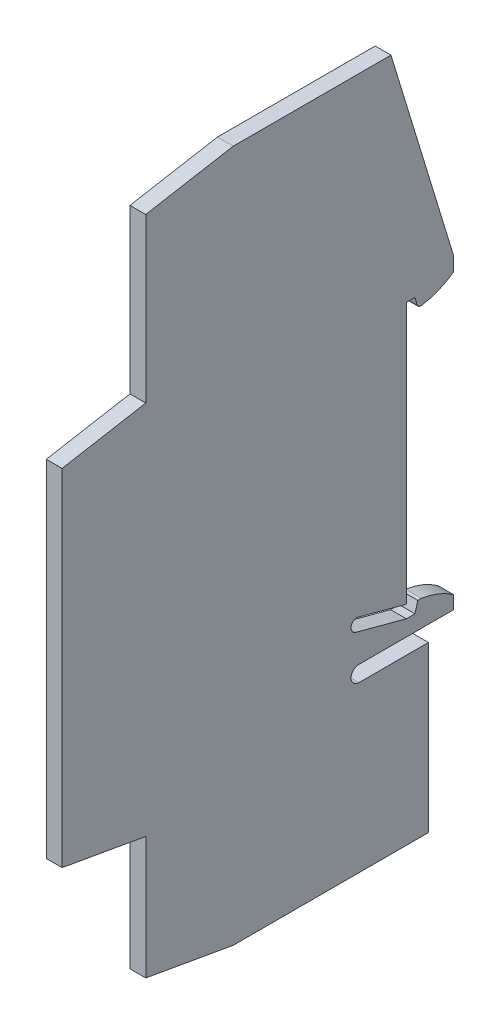
ISO-10303-21;
HEADER;
FILE_DESCRIPTION(('STEP AP214'),'2;1');
FILE_NAME('part.step','',(''),(''),'','','');
FILE_SCHEMA(('AUTOMOTIVE_DESIGN { 1 0 10303 214 1 1 1 1 }'));
ENDSEC;
DATA;
#1=APPLICATION_CONTEXT('core data for automotive mechanical design processes');
#2=APPLICATION_PROTOCOL_DEFINITION('international standard','automotive_design',2000,#1);
#3=PRODUCT_CONTEXT('',#1,'mechanical');
#4=PRODUCT('Part','Part','',(#3));
#5=PRODUCT_RELATED_PRODUCT_CATEGORY('part','',(#4));
#6=PRODUCT_DEFINITION_FORMATION('','',#4);
#7=PRODUCT_DEFINITION_CONTEXT('part definition',#1,'design');
#8=PRODUCT_DEFINITION('design','',#6,#7);
#9=PRODUCT_DEFINITION_SHAPE('','',#8);
#10=(LENGTH_UNIT() NAMED_UNIT(*) SI_UNIT(.MILLI.,.METRE.));
#11=(NAMED_UNIT(*) PLANE_ANGLE_UNIT() SI_UNIT($,.RADIAN.));
#12=(NAMED_UNIT(*) SI_UNIT($,.STERADIAN.) SOLID_ANGLE_UNIT());
#13=UNCERTAINTY_MEASURE_WITH_UNIT(LENGTH_MEASURE(1.E-05),#10,'distance_accuracy_value','');
#14=(GEOMETRIC_REPRESENTATION_CONTEXT(3) GLOBAL_UNCERTAINTY_ASSIGNED_CONTEXT((#13)) GLOBAL_UNIT_ASSIGNED_CONTEXT((#10,
#11,#12)) REPRESENTATION_CONTEXT('',''));
#15=CARTESIAN_POINT('',(0.,0.,0.));
#16=DIRECTION('',(0.,0.,1.));
#17=DIRECTION('',(1.,0.,0.));
#18=AXIS2_PLACEMENT_3D('',#15,#16,#17);
#19=CARTESIAN_POINT('',(2.2000024,27.5904927570764,12.960969228685));
#20=DIRECTION('',(0.,0.258819045104379,0.96592582628857));
#21=DIRECTION('',(0.,-0.96592582628857,0.258819045104379));
#22=AXIS2_PLACEMENT_3D('',#19,#20,#21);
#23=PLANE('',#22);
#24=DIRECTION('',(1.,0.,0.));
#25=VECTOR('',#24,1.);
#26=CARTESIAN_POINT('',(2.2000024,27.5904927570777,12.9609692286847));
#27=LINE('',#26,#25);
#28=CARTESIAN_POINT('',(0.,27.5904927570777,12.9609692286847));
#29=VERTEX_POINT('',#28);
#30=CARTESIAN_POINT('',(2.,27.5904927570777,12.9609692286847));
#31=VERTEX_POINT('',#30);
#32=EDGE_CURVE('E388',#29,#31,#27,.T.);
#33=ORIENTED_EDGE('',*,*,#32,.T.);
#34=DIRECTION('',(0.,-0.96592582628857,0.258819045104379));
#35=VECTOR('',#34,1.);
#36=CARTESIAN_POINT('',(2.,27.5904927570764,12.960969228685));
#37=LINE('',#36,#35);
#38=CARTESIAN_POINT('',(2.,27.5465611734832,12.9727406610311));
#39=VERTEX_POINT('',#38);
#40=EDGE_CURVE('E401',#39,#31,#37,.F.);
#41=ORIENTED_EDGE('',*,*,#40,.F.);
#42=DIRECTION('',(1.,0.,0.));
#43=VECTOR('',#42,1.);
#44=CARTESIAN_POINT('',(2.2000024,27.5465611734825,12.9727406610312));
#45=LINE('',#44,#43);
#46=CARTESIAN_POINT('',(0.,27.5465611734832,12.9727406610311));
#47=VERTEX_POINT('',#46);
#48=EDGE_CURVE('E357',#39,#47,#45,.F.);
#49=ORIENTED_EDGE('',*,*,#48,.T.);
#50=DIRECTION('',(0.,-0.96592582628857,0.258819045104379));
#51=VECTOR('',#50,1.);
#52=CARTESIAN_POINT('',(0.,27.5904927570764,12.960969228685));
#53=LINE('',#52,#51);
#54=EDGE_CURVE('E394',#29,#47,#53,.T.);
#55=ORIENTED_EDGE('',*,*,#54,.F.);
#56=EDGE_LOOP('',(#33,#41,#49,#55));
#57=FACE_BOUND('',#56,.T.);
#58=ADVANCED_FACE('F16',(#57),#23,.F.);
#59=CARTESIAN_POINT('',(0.,24.8499999999994,4.9));
#60=DIRECTION('',(0.,0.258819045102552,0.96592582628906));
#61=DIRECTION('',(0.,-0.96592582628906,0.258819045102552));
#62=AXIS2_PLACEMENT_3D('',#59,#60,#61);
#63=PLANE('',#62);
#64=DIRECTION('',(0.,-0.96592582628906,0.258819045102552));
#65=VECTOR('',#64,1.);
#66=CARTESIAN_POINT('',(2.,24.8499999999994,4.9));
#67=LINE('',#66,#65);
#68=CARTESIAN_POINT('',(2.,24.8499999999994,4.9));
#69=VERTEX_POINT('',#68);
#70=CARTESIAN_POINT('',(2.,26.1499999999994,4.5516660498395));
#71=VERTEX_POINT('',#70);
#72=EDGE_CURVE('E227',#69,#71,#67,.F.);
#73=ORIENTED_EDGE('',*,*,#72,.T.);
#74=DIRECTION('',(-1.,0.,0.));
#75=VECTOR('',#74,1.);
#76=CARTESIAN_POINT('',(0.,26.1499999999994,4.5516660498395));
#77=LINE('',#76,#75);
#78=CARTESIAN_POINT('',(0.,26.1499999999994,4.5516660498395));
#79=VERTEX_POINT('',#78);
#80=EDGE_CURVE('E351',#79,#71,#77,.F.);
#81=ORIENTED_EDGE('',*,*,#80,.F.);
#82=DIRECTION('',(0.,-0.96592582628906,0.258819045102552));
#83=VECTOR('',#82,1.);
#84=CARTESIAN_POINT('',(0.,24.8499999999994,4.9));
#85=LINE('',#84,#83);
#86=CARTESIAN_POINT('',(0.,24.8499999999994,4.9));
#87=VERTEX_POINT('',#86);
#88=EDGE_CURVE('E392',#79,#87,#85,.T.);
#89=ORIENTED_EDGE('',*,*,#88,.T.);
#90=DIRECTION('',(-1.,0.,0.));
#91=VECTOR('',#90,1.);
#92=CARTESIAN_POINT('',(0.,24.8499999999994,4.9));
#93=LINE('',#92,#91);
#94=EDGE_CURVE('E356',#69,#87,#93,.T.);
#95=ORIENTED_EDGE('',*,*,#94,.F.);
#96=EDGE_LOOP('',(#73,#81,#89,#95));
#97=FACE_BOUND('',#96,.T.);
#98=ADVANCED_FACE('F685',(#97),#63,.T.);
#99=CARTESIAN_POINT('',(0.,58.749999999999,4.1680025558501));
#100=DIRECTION('',(1.,0.,0.));
#101=DIRECTION('',(0.,1.,0.));
#102=AXIS2_PLACEMENT_3D('',#99,#100,#101);
#103=CYLINDRICAL_SURFACE('',#102,0.5);
#104=CARTESIAN_POINT('',(2.,58.749999999999,4.1680025558501));
#105=DIRECTION('',(1.,0.,0.));
#106=DIRECTION('',(0.,1.,0.));
#107=AXIS2_PLACEMENT_3D('',#104,#105,#106);
#108=CIRCLE('',#107,0.5);
#109=CARTESIAN_POINT('',(2.,58.249999999999,4.16800255585047));
#110=VERTEX_POINT('',#109);
#111=CARTESIAN_POINT('',(2.,58.6205904774477,4.6509654689947));
#112=VERTEX_POINT('',#111);
#113=EDGE_CURVE('E226',#110,#112,#108,.F.);
#114=ORIENTED_EDGE('',*,*,#113,.T.);
#115=DIRECTION('',(1.,0.,0.));
#116=VECTOR('',#115,1.);
#117=CARTESIAN_POINT('',(0.,58.6205904774477,4.6509654689947));
#118=LINE('',#117,#116);
#119=CARTESIAN_POINT('',(0.,58.6205904774477,4.6509654689947));
#120=VERTEX_POINT('',#119);
#121=EDGE_CURVE('E224',#120,#112,#118,.T.);
#122=ORIENTED_EDGE('',*,*,#121,.F.);
#123=CARTESIAN_POINT('',(0.,58.749999999999,4.1680025558501));
#124=DIRECTION('',(1.,0.,0.));
#125=DIRECTION('',(0.,1.,0.));
#126=AXIS2_PLACEMENT_3D('',#123,#124,#125);
#127=CIRCLE('',#126,0.5);
#128=CARTESIAN_POINT('',(0.,58.2499999999989,4.1680025558503));
#129=VERTEX_POINT('',#128);
#130=EDGE_CURVE('E19',#120,#129,#127,.T.);
#131=ORIENTED_EDGE('',*,*,#130,.T.);
#132=DIRECTION('',(1.,0.,0.));
#133=VECTOR('',#132,1.);
#134=CARTESIAN_POINT('',(0.,58.249999999999,4.1680025558505));
#135=LINE('',#134,#133);
#136=EDGE_CURVE('E222',#110,#129,#135,.F.);
#137=ORIENTED_EDGE('',*,*,#136,.F.);
#138=EDGE_LOOP('',(#114,#122,#131,#137));
#139=FACE_BOUND('',#138,.T.);
#140=ADVANCED_FACE('F221',(#139),#103,.T.);
#141=CARTESIAN_POINT('',(0.,58.6205904774477,4.6509654689947));
#142=DIRECTION('',(0.,-0.258819045102457,0.965925826289086));
#143=DIRECTION('',(0.,-0.965925826289086,-0.258819045102457));
#144=AXIS2_PLACEMENT_3D('',#141,#142,#143);
#145=PLANE('',#144);
#146=DIRECTION('',(0.,-0.965925826289086,-0.258819045102457));
#147=VECTOR('',#146,1.);
#148=CARTESIAN_POINT('',(2.,58.6205904774477,4.6509654689947));
#149=LINE('',#148,#147);
#150=CARTESIAN_POINT('',(2.,59.5499999999994,4.90000000000012));
#151=VERTEX_POINT('',#150);
#152=EDGE_CURVE('E375',#112,#151,#149,.F.);
#153=ORIENTED_EDGE('',*,*,#152,.T.);
#154=DIRECTION('',(1.,0.,0.));
#155=VECTOR('',#154,1.);
#156=CARTESIAN_POINT('',(0.,59.5499999999994,4.9000000000001));
#157=LINE('',#156,#155);
#158=CARTESIAN_POINT('',(0.,59.5499999999994,4.9000000000001));
#159=VERTEX_POINT('',#158);
#160=EDGE_CURVE('E260',#159,#151,#157,.T.);
#161=ORIENTED_EDGE('',*,*,#160,.F.);
#162=DIRECTION('',(0.,0.965925826289098,0.258819045102411));
#163=VECTOR('',#162,1.);
#164=CARTESIAN_POINT('',(0.,58.6205904774477,4.6509654689947));
#165=LINE('',#164,#163);
#166=EDGE_CURVE('E242',#120,#159,#165,.T.);
#167=ORIENTED_EDGE('',*,*,#166,.F.);
#168=ORIENTED_EDGE('',*,*,#121,.T.);
#169=EDGE_LOOP('',(#153,#161,#167,#168));
#170=FACE_BOUND('',#169,.T.);
#171=ADVANCED_FACE('F439',(#170),#145,.T.);
#172=CARTESIAN_POINT('',(2.2000024,27.4093194255047,12.2848211502827));
#173=DIRECTION('',(1.,0.,0.));
#174=DIRECTION('',(0.,1.,0.));
#175=AXIS2_PLACEMENT_3D('',#172,#173,#174);
#176=CYLINDRICAL_SURFACE('',#175,0.70000000000001);
#177=ORIENTED_EDGE('',*,*,#32,.F.);
#178=CARTESIAN_POINT('',(0.,27.4093194255047,12.2848211502827));
#179=DIRECTION('',(1.,0.,0.));
#180=DIRECTION('',(0.,1.,0.));
#181=AXIS2_PLACEMENT_3D('',#178,#179,#180);
#182=CIRCLE('',#181,0.70000000000001);
#183=CARTESIAN_POINT('',(0.,28.085467503907,12.1036478187109));
#184=VERTEX_POINT('',#183);
#185=EDGE_CURVE('E236',#184,#29,#182,.T.);
#186=ORIENTED_EDGE('',*,*,#185,.F.);
#187=DIRECTION('',(1.,0.,0.));
#188=VECTOR('',#187,1.);
#189=CARTESIAN_POINT('',(0.,28.085467503907,12.1036478187109));
#190=LINE('',#189,#188);
#191=CARTESIAN_POINT('',(2.,28.085467503907,12.1036478187109));
#192=VERTEX_POINT('',#191);
#193=EDGE_CURVE('E407',#192,#184,#190,.F.);
#194=ORIENTED_EDGE('',*,*,#193,.F.);
#195=CARTESIAN_POINT('',(2.,27.4093194255047,12.2848211502827));
#196=DIRECTION('',(1.,0.,0.));
#197=DIRECTION('',(0.,1.,0.));
#198=AXIS2_PLACEMENT_3D('',#195,#196,#197);
#199=CIRCLE('',#198,0.70000000000001);
#200=EDGE_CURVE('E391',#31,#192,#199,.F.);
#201=ORIENTED_EDGE('',*,*,#200,.F.);
#202=EDGE_LOOP('',(#177,#186,#194,#201));
#203=FACE_BOUND('',#202,.T.);
#204=ADVANCED_FACE('F701',(#203),#176,.F.);
#205=CARTESIAN_POINT('',(2.2000024,27.3395059374004,12.2));
#206=DIRECTION('',(1.,0.,0.));
#207=DIRECTION('',(0.,1.,0.));
#208=AXIS2_PLACEMENT_3D('',#205,#206,#207);
#209=CYLINDRICAL_SURFACE('',#208,0.799999999999955);
#210=CARTESIAN_POINT('',(2.,27.3395059374004,12.2));
#211=DIRECTION('',(1.,0.,0.));
#212=DIRECTION('',(0.,1.,0.));
#213=AXIS2_PLACEMENT_3D('',#210,#211,#212);
#214=CIRCLE('',#213,0.799999999999955);
#215=CARTESIAN_POINT('',(2.,26.5667652763692,12.407055236082));
#216=VERTEX_POINT('',#215);
#217=EDGE_CURVE('E387',#216,#39,#214,.F.);
#218=ORIENTED_EDGE('',*,*,#217,.F.);
#219=DIRECTION('',(1.,0.,0.));
#220=VECTOR('',#219,1.);
#221=CARTESIAN_POINT('',(0.,26.5667652763692,12.407055236082));
#222=LINE('',#221,#220);
#223=CARTESIAN_POINT('',(0.,26.5667652763692,12.407055236082));
#224=VERTEX_POINT('',#223);
#225=EDGE_CURVE('E363',#224,#216,#222,.T.);
#226=ORIENTED_EDGE('',*,*,#225,.F.);
#227=CARTESIAN_POINT('',(0.,27.3395059374004,12.2));
#228=DIRECTION('',(1.,0.,0.));
#229=DIRECTION('',(0.,1.,0.));
#230=AXIS2_PLACEMENT_3D('',#227,#228,#229);
#231=CIRCLE('',#230,0.799999999999955);
#232=EDGE_CURVE('E369',#47,#224,#231,.T.);
#233=ORIENTED_EDGE('',*,*,#232,.F.);
#234=ORIENTED_EDGE('',*,*,#48,.F.);
#235=EDGE_LOOP('',(#218,#226,#233,#234));
#236=FACE_BOUND('',#235,.T.);
#237=ADVANCED_FACE('F694',(#236),#209,.F.);
#238=CARTESIAN_POINT('',(0.,24.8499999999994,6.));
#239=DIRECTION('',(0.,1.,0.));
#240=DIRECTION('',(-1.,0.,0.));
#241=AXIS2_PLACEMENT_3D('',#238,#239,#240);
#242=PLANE('',#241);
#243=DIRECTION('',(0.,0.,1.));
#244=VECTOR('',#243,1.);
#245=CARTESIAN_POINT('',(2.,24.8499999999994,6.));
#246=LINE('',#245,#244);
#247=CARTESIAN_POINT('',(2.,24.8499999999994,6.));
#248=VERTEX_POINT('',#247);
#249=EDGE_CURVE('E354',#248,#69,#246,.F.);
#250=ORIENTED_EDGE('',*,*,#249,.T.);
#251=ORIENTED_EDGE('',*,*,#94,.T.);
#252=DIRECTION('',(0.,0.,1.));
#253=VECTOR('',#252,1.);
#254=CARTESIAN_POINT('',(0.,24.8499999999994,4.632542));
#255=LINE('',#254,#253);
#256=CARTESIAN_POINT('',(0.,24.8499999999994,6.));
#257=VERTEX_POINT('',#256);
#258=EDGE_CURVE('E255',#257,#87,#255,.F.);
#259=ORIENTED_EDGE('',*,*,#258,.F.);
#260=DIRECTION('',(1.,0.,0.));
#261=VECTOR('',#260,1.);
#262=CARTESIAN_POINT('',(0.,24.8499999999994,6.));
#263=LINE('',#262,#261);
#264=EDGE_CURVE('E430',#248,#257,#263,.F.);
#265=ORIENTED_EDGE('',*,*,#264,.F.);
#266=EDGE_LOOP('',(#250,#251,#259,#265));
#267=FACE_BOUND('',#266,.T.);
#268=ADVANCED_FACE('F687',(#267),#242,.T.);
#269=CARTESIAN_POINT('',(0.,26.1499999999994,4.5516660498395));
#270=DIRECTION('',(0.,1.,0.));
#271=DIRECTION('',(-1.,0.,0.));
#272=AXIS2_PLACEMENT_3D('',#269,#270,#271);
#273=PLANE('',#272);
#274=DIRECTION('',(0.,0.,1.));
#275=VECTOR('',#274,1.);
#276=CARTESIAN_POINT('',(2.,26.1499999999994,4.5516660498395));
#277=LINE('',#276,#275);
#278=CARTESIAN_POINT('',(2.,26.1499999999994,4.09999999999975));
#279=VERTEX_POINT('',#278);
#280=EDGE_CURVE('E347',#71,#279,#277,.F.);
#281=ORIENTED_EDGE('',*,*,#280,.T.);
#282=DIRECTION('',(1.,0.,0.));
#283=VECTOR('',#282,1.);
#284=CARTESIAN_POINT('',(0.,26.1499999999994,4.09999999999989));
#285=LINE('',#284,#283);
#286=CARTESIAN_POINT('',(0.,26.1499999999994,4.09999999999975));
#287=VERTEX_POINT('',#286);
#288=EDGE_CURVE('E429',#287,#279,#285,.T.);
#289=ORIENTED_EDGE('',*,*,#288,.F.);
#290=DIRECTION('',(0.,0.,1.));
#291=VECTOR('',#290,1.);
#292=CARTESIAN_POINT('',(0.,26.1499999999994,4.632542));
#293=LINE('',#292,#291);
#294=EDGE_CURVE('E247',#79,#287,#293,.F.);
#295=ORIENTED_EDGE('',*,*,#294,.F.);
#296=ORIENTED_EDGE('',*,*,#80,.T.);
#297=EDGE_LOOP('',(#281,#289,#295,#296));
#298=FACE_BOUND('',#297,.T.);
#299=ADVANCED_FACE('F678',(#298),#273,.T.);
#300=CARTESIAN_POINT('',(0.,23.9575145012983,0.));
#301=DIRECTION('',(0.,0.,-1.));
#302=DIRECTION('',(-1.,0.,0.));
#303=AXIS2_PLACEMENT_3D('',#300,#301,#302);
#304=PLANE('',#303);
#305=DIRECTION('',(0.,1.,0.));
#306=VECTOR('',#305,1.);
#307=CARTESIAN_POINT('',(2.,23.9575145012983,0.));
#308=LINE('',#307,#306);
#309=CARTESIAN_POINT('',(2.,24.4910563468668,0.));
#310=VERTEX_POINT('',#309);
#311=CARTESIAN_POINT('',(2.,22.8499999999994,0.));
#312=VERTEX_POINT('',#311);
#313=EDGE_CURVE('E270',#310,#312,#308,.F.);
#314=ORIENTED_EDGE('',*,*,#313,.T.);
#315=DIRECTION('',(1.,0.,0.));
#316=VECTOR('',#315,1.);
#317=CARTESIAN_POINT('',(0.,22.8499999999994,0.));
#318=LINE('',#317,#316);
#319=CARTESIAN_POINT('',(0.,22.8499999999994,0.));
#320=VERTEX_POINT('',#319);
#321=EDGE_CURVE('E343',#320,#312,#318,.T.);
#322=ORIENTED_EDGE('',*,*,#321,.F.);
#323=DIRECTION('',(0.,-1.,0.));
#324=VECTOR('',#323,1.);
#325=CARTESIAN_POINT('',(0.,76.5803699999991,0.));
#326=LINE('',#325,#324);
#327=CARTESIAN_POINT('',(0.,24.4910563468668,0.));
#328=VERTEX_POINT('',#327);
#329=EDGE_CURVE('E243',#328,#320,#326,.T.);
#330=ORIENTED_EDGE('',*,*,#329,.F.);
#331=DIRECTION('',(1.,0.,0.));
#332=VECTOR('',#331,1.);
#333=CARTESIAN_POINT('',(0.,24.4910563468669,0.));
#334=LINE('',#333,#332);
#335=EDGE_CURVE('E471',#310,#328,#334,.F.);
#336=ORIENTED_EDGE('',*,*,#335,.F.);
#337=EDGE_LOOP('',(#314,#322,#330,#336));
#338=FACE_BOUND('',#337,.T.);
#339=ADVANCED_FACE('F671',(#338),#304,.T.);
#340=CARTESIAN_POINT('',(0.,58.2499999999989,4.0999999999994));
#341=DIRECTION('',(0.,-1.,6.90336676711923E-13));
#342=DIRECTION('',(0.,-6.90336676711923E-13,-1.));
#343=AXIS2_PLACEMENT_3D('',#340,#341,#342);
#344=PLANE('',#343);
#345=DIRECTION('',(0.,-6.90336676711923E-13,-1.));
#346=VECTOR('',#345,1.);
#347=CARTESIAN_POINT('',(2.,58.2499999999989,4.0999999999994));
#348=LINE('',#347,#346);
#349=CARTESIAN_POINT('',(2.,58.2499999999989,4.09999999999941));
#350=VERTEX_POINT('',#349);
#351=EDGE_CURVE('E234',#350,#110,#348,.F.);
#352=ORIENTED_EDGE('',*,*,#351,.T.);
#353=ORIENTED_EDGE('',*,*,#136,.T.);
#354=DIRECTION('',(0.,0.,1.));
#355=VECTOR('',#354,1.);
#356=CARTESIAN_POINT('',(0.,58.2499999999989,4.632542));
#357=LINE('',#356,#355);
#358=CARTESIAN_POINT('',(0.,58.2499999999989,4.09999999999937));
#359=VERTEX_POINT('',#358);
#360=EDGE_CURVE('E232',#359,#129,#357,.T.);
#361=ORIENTED_EDGE('',*,*,#360,.F.);
#362=DIRECTION('',(-1.,0.,0.));
#363=VECTOR('',#362,1.);
#364=CARTESIAN_POINT('',(0.,58.2499999999989,4.0999999999994));
#365=LINE('',#364,#363);
#366=EDGE_CURVE('E423',#350,#359,#365,.T.);
#367=ORIENTED_EDGE('',*,*,#366,.F.);
#368=EDGE_LOOP('',(#352,#353,#361,#367));
#369=FACE_BOUND('',#368,.T.);
#370=ADVANCED_FACE('F230',(#369),#344,.T.);
#371=CARTESIAN_POINT('',(0.,76.5803699999991,4.632542));
#372=DIRECTION('',(-1.,0.,0.));
#373=DIRECTION('',(0.,-1.,0.));
#374=AXIS2_PLACEMENT_3D('',#371,#372,#373);
#375=PLANE('',#374);
#376=DIRECTION('',(0.,0.,1.));
#377=VECTOR('',#376,1.);
#378=CARTESIAN_POINT('',(0.,59.5499999999994,4.9000000000001));
#379=LINE('',#378,#377);
#380=CARTESIAN_POINT('',(0.,59.5499999999994,6.));
#381=VERTEX_POINT('',#380);
#382=EDGE_CURVE('E245',#381,#159,#379,.F.);
#383=ORIENTED_EDGE('',*,*,#382,.F.);
#384=DIRECTION('',(0.,1.,0.));
#385=VECTOR('',#384,1.);
#386=CARTESIAN_POINT('',(0.,59.5499999999994,6.));
#387=LINE('',#386,#385);
#388=CARTESIAN_POINT('',(0.,26.4499999999994,6.));
#389=VERTEX_POINT('',#388);
#390=EDGE_CURVE('E266',#389,#381,#387,.T.);
#391=ORIENTED_EDGE('',*,*,#390,.F.);
#392=DIRECTION('',(0.,-0.258819045102526,-0.965925826289067));
#393=VECTOR('',#392,1.);
#394=CARTESIAN_POINT('',(0.,26.7983339501599,7.29999999999998));
#395=LINE('',#394,#393);
#396=EDGE_CURVE('E364',#184,#389,#395,.T.);
#397=ORIENTED_EDGE('',*,*,#396,.F.);
#398=ORIENTED_EDGE('',*,*,#185,.T.);
#399=ORIENTED_EDGE('',*,*,#54,.T.);
#400=ORIENTED_EDGE('',*,*,#232,.T.);
#401=DIRECTION('',(0.,0.258819045102527,0.965925826289067));
#402=VECTOR('',#401,1.);
#403=CARTESIAN_POINT('',(0.,26.5667652763692,12.407055236082));
#404=LINE('',#403,#402);
#405=EDGE_CURVE('E360',#257,#224,#404,.T.);
#406=ORIENTED_EDGE('',*,*,#405,.F.);
#407=ORIENTED_EDGE('',*,*,#258,.T.);
#408=ORIENTED_EDGE('',*,*,#88,.F.);
#409=ORIENTED_EDGE('',*,*,#294,.T.);
#410=CARTESIAN_POINT('',(0.,16.7560273206219,5.5153717882976));
#411=DIRECTION('',(1.,0.,0.));
#412=DIRECTION('',(0.,1.,0.));
#413=AXIS2_PLACEMENT_3D('',#410,#411,#412);
#414=CIRCLE('',#413,9.50000000000003);
#415=EDGE_CURVE('E426',#328,#287,#414,.T.);
#416=ORIENTED_EDGE('',*,*,#415,.F.);
#417=ORIENTED_EDGE('',*,*,#329,.T.);
#418=DIRECTION('',(0.,0.,1.));
#419=VECTOR('',#418,1.);
#420=CARTESIAN_POINT('',(0.,22.8499999999994,1.));
#421=LINE('',#420,#419);
#422=CARTESIAN_POINT('',(0.,22.8499999999994,12.));
#423=VERTEX_POINT('',#422);
#424=EDGE_CURVE('E339',#423,#320,#421,.F.);
#425=ORIENTED_EDGE('',*,*,#424,.F.);
#426=CARTESIAN_POINT('',(0.,21.8499999999994,12.));
#427=DIRECTION('',(1.,0.,0.));
#428=DIRECTION('',(0.,1.,0.));
#429=AXIS2_PLACEMENT_3D('',#426,#427,#428);
#430=CIRCLE('',#429,1.);
#431=CARTESIAN_POINT('',(0.,20.8499999999994,12.));
#432=VERTEX_POINT('',#431);
#433=EDGE_CURVE('E342',#423,#432,#430,.T.);
#434=ORIENTED_EDGE('',*,*,#433,.T.);
#435=DIRECTION('',(0.,0.,1.));
#436=VECTOR('',#435,1.);
#437=CARTESIAN_POINT('',(0.,20.8499999999994,12.));
#438=LINE('',#437,#436);
#439=CARTESIAN_POINT('',(0.,20.8499999999994,3.2));
#440=VERTEX_POINT('',#439);
#441=EDGE_CURVE('E334',#440,#432,#438,.T.);
#442=ORIENTED_EDGE('',*,*,#441,.F.);
#443=DIRECTION('',(0.,1.,0.));
#444=VECTOR('',#443,1.);
#445=CARTESIAN_POINT('',(0.,19.8499999999994,3.2));
#446=LINE('',#445,#444);
#447=CARTESIAN_POINT('',(0.,0.,3.2));
#448=VERTEX_POINT('',#447);
#449=EDGE_CURVE('E329',#448,#440,#446,.T.);
#450=ORIENTED_EDGE('',*,*,#449,.F.);
#451=DIRECTION('',(0.,0.,1.));
#452=VECTOR('',#451,1.);
#453=CARTESIAN_POINT('',(0.,0.,3.20000000000001));
#454=LINE('',#453,#452);
#455=CARTESIAN_POINT('',(0.,0.,27.9273800337064));
#456=VERTEX_POINT('',#455);
#457=EDGE_CURVE('E324',#456,#448,#454,.F.);
#458=ORIENTED_EDGE('',*,*,#457,.F.);
#459=DIRECTION('',(0.,-0.173648177667345,-0.984807753012135));
#460=VECTOR('',#459,1.);
#461=CARTESIAN_POINT('',(0.,0.,27.9273800337064));
#462=LINE('',#461,#460);
#463=CARTESIAN_POINT('',(0.,1.95240164719202,38.9999999999912));
#464=VERTEX_POINT('',#463);
#465=EDGE_CURVE('E319',#464,#456,#462,.T.);
#466=ORIENTED_EDGE('',*,*,#465,.F.);
#467=DIRECTION('',(0.,1.,0.));
#468=VECTOR('',#467,1.);
#469=CARTESIAN_POINT('',(0.,17.3999999999791,38.9999999999912));
#470=LINE('',#469,#468);
#471=CARTESIAN_POINT('',(0.,17.4833356516981,38.9999999999912));
#472=VERTEX_POINT('',#471);
#473=EDGE_CURVE('E314',#472,#464,#470,.F.);
#474=ORIENTED_EDGE('',*,*,#473,.F.);
#475=DIRECTION('',(0.,-0.173648177667346,-0.984807753012135));
#476=VECTOR('',#475,1.);
#477=CARTESIAN_POINT('',(0.,17.4833356516981,38.9999999999912));
#478=LINE('',#477,#476);
#479=CARTESIAN_POINT('',(0.,19.3524016472134,49.5999999999967));
#480=VERTEX_POINT('',#479);
#481=EDGE_CURVE('E309',#480,#472,#478,.T.);
#482=ORIENTED_EDGE('',*,*,#481,.F.);
#483=DIRECTION('',(0.,1.,0.));
#484=VECTOR('',#483,1.);
#485=CARTESIAN_POINT('',(0.,19.3524016472134,49.5999999999967));
#486=LINE('',#485,#484);
#487=CARTESIAN_POINT('',(0.,63.1475983527838,49.5999999999967));
#488=VERTEX_POINT('',#487);
#489=EDGE_CURVE('E304',#488,#480,#486,.F.);
#490=ORIENTED_EDGE('',*,*,#489,.F.);
#491=DIRECTION('',(0.,-0.173648177667344,0.984807753012135));
#492=VECTOR('',#491,1.);
#493=CARTESIAN_POINT('',(0.,63.1475983527838,49.5999999999967));
#494=LINE('',#493,#492);
#495=CARTESIAN_POINT('',(0.,65.0166643482991,38.9999999999912));
#496=VERTEX_POINT('',#495);
#497=EDGE_CURVE('E299',#496,#488,#494,.T.);
#498=ORIENTED_EDGE('',*,*,#497,.F.);
#499=DIRECTION('',(0.,1.,0.));
#500=VECTOR('',#499,1.);
#501=CARTESIAN_POINT('',(0.,65.0166643482991,38.9999999999912));
#502=LINE('',#501,#500);
#503=CARTESIAN_POINT('',(0.,85.6975982527844,38.9999999999912));
#504=VERTEX_POINT('',#503);
#505=EDGE_CURVE('E294',#504,#496,#502,.F.);
#506=ORIENTED_EDGE('',*,*,#505,.F.);
#507=DIRECTION('',(0.,-0.173648177667346,0.984807753012135));
#508=VECTOR('',#507,1.);
#509=CARTESIAN_POINT('',(0.,85.6975982527844,38.9999999999912));
#510=LINE('',#509,#508);
#511=CARTESIAN_POINT('',(0.,87.6499998999973,27.9273800335883));
#512=VERTEX_POINT('',#511);
#513=EDGE_CURVE('E289',#512,#504,#510,.T.);
#514=ORIENTED_EDGE('',*,*,#513,.F.);
#515=DIRECTION('',(0.,0.,1.));
#516=VECTOR('',#515,1.);
#517=CARTESIAN_POINT('',(0.,87.6499998999973,27.9273800335883));
#518=LINE('',#517,#516);
#519=CARTESIAN_POINT('',(0.,87.6499998999973,7.94933337881473));
#520=VERTEX_POINT('',#519);
#521=EDGE_CURVE('E284',#520,#512,#518,.T.);
#522=ORIENTED_EDGE('',*,*,#521,.F.);
#523=DIRECTION('',(0.,0.956304755963035,0.292371704722737));
#524=VECTOR('',#523,1.);
#525=CARTESIAN_POINT('',(0.,87.6418698393331,7.94684776982756));
#526=LINE('',#525,#524);
#527=CARTESIAN_POINT('',(0.,61.6489020026976,0.));
#528=VERTEX_POINT('',#527);
#529=EDGE_CURVE('E278',#528,#520,#526,.T.);
#530=ORIENTED_EDGE('',*,*,#529,.F.);
#531=DIRECTION('',(0.,1.,0.));
#532=VECTOR('',#531,1.);
#533=CARTESIAN_POINT('',(0.,61.3499999999994,0.));
#534=LINE('',#533,#532);
#535=CARTESIAN_POINT('',(0.,59.9089436531316,0.));
#536=VERTEX_POINT('',#535);
#537=EDGE_CURVE('E271',#536,#528,#534,.T.);
#538=ORIENTED_EDGE('',*,*,#537,.F.);
#539=CARTESIAN_POINT('',(0.,67.6439726793753,5.5153717882976));
#540=DIRECTION('',(-1.,0.,0.));
#541=DIRECTION('',(0.,-1.,0.));
#542=AXIS2_PLACEMENT_3D('',#539,#540,#541);
#543=CIRCLE('',#542,9.499999999999);
#544=EDGE_CURVE('E241',#359,#536,#543,.F.);
#545=ORIENTED_EDGE('',*,*,#544,.F.);
#546=ORIENTED_EDGE('',*,*,#360,.T.);
#547=ORIENTED_EDGE('',*,*,#130,.F.);
#548=ORIENTED_EDGE('',*,*,#166,.T.);
#549=EDGE_LOOP('',(#383,#391,#397,#398,#399,#400,#406,#407,#408,#409,#416,#417,#425,#434,#442,
#450,#458,#466,#474,#482,#490,#498,#506,#514,#522,#530,#538,#545,#546,#547,#548));
#550=FACE_BOUND('',#549,.T.);
#551=ADVANCED_FACE('F239',(#550),#375,.T.);
#552=CARTESIAN_POINT('',(0.,59.5499999999994,4.9000000000001));
#553=DIRECTION('',(0.,-1.,0.));
#554=DIRECTION('',(1.,0.,0.));
#555=AXIS2_PLACEMENT_3D('',#552,#553,#554);
#556=PLANE('',#555);
#557=DIRECTION('',(0.,0.,1.));
#558=VECTOR('',#557,1.);
#559=CARTESIAN_POINT('',(2.,59.5499999999994,4.9000000000001));
#560=LINE('',#559,#558);
#561=CARTESIAN_POINT('',(2.,59.5499999999994,6.));
#562=VERTEX_POINT('',#561);
#563=EDGE_CURVE('E34',#151,#562,#560,.T.);
#564=ORIENTED_EDGE('',*,*,#563,.T.);
#565=DIRECTION('',(-1.,0.,0.));
#566=VECTOR('',#565,1.);
#567=CARTESIAN_POINT('',(0.,59.5499999999994,6.));
#568=LINE('',#567,#566);
#569=EDGE_CURVE('E263',#381,#562,#568,.F.);
#570=ORIENTED_EDGE('',*,*,#569,.F.);
#571=ORIENTED_EDGE('',*,*,#382,.T.);
#572=ORIENTED_EDGE('',*,*,#160,.T.);
#573=EDGE_LOOP('',(#564,#570,#571,#572));
#574=FACE_BOUND('',#573,.T.);
#575=ADVANCED_FACE('F450',(#574),#556,.T.);
#576=CARTESIAN_POINT('',(0.,26.7983339501599,7.29999999999998));
#577=DIRECTION('',(0.,-0.965925826289067,0.258819045102526));
#578=DIRECTION('',(0.,-0.258819045102526,-0.965925826289067));
#579=AXIS2_PLACEMENT_3D('',#576,#577,#578);
#580=PLANE('',#579);
#581=ORIENTED_EDGE('',*,*,#193,.T.);
#582=ORIENTED_EDGE('',*,*,#396,.T.);
#583=DIRECTION('',(-1.,0.,0.));
#584=VECTOR('',#583,1.);
#585=CARTESIAN_POINT('',(0.,26.4499999999994,6.));
#586=LINE('',#585,#584);
#587=CARTESIAN_POINT('',(2.,26.4499999999994,6.));
#588=VERTEX_POINT('',#587);
#589=EDGE_CURVE('E265',#588,#389,#586,.T.);
#590=ORIENTED_EDGE('',*,*,#589,.F.);
#591=DIRECTION('',(0.,0.258819045102524,0.965925826289067));
#592=VECTOR('',#591,1.);
#593=CARTESIAN_POINT('',(2.,26.4499999999994,6.));
#594=LINE('',#593,#592);
#595=EDGE_CURVE('E444',#588,#192,#594,.T.);
#596=ORIENTED_EDGE('',*,*,#595,.T.);
#597=EDGE_LOOP('',(#581,#582,#590,#596));
#598=FACE_BOUND('',#597,.T.);
#599=ADVANCED_FACE('F753',(#598),#580,.T.);
#600=CARTESIAN_POINT('',(0.,26.5667652763692,12.407055236082));
#601=DIRECTION('',(0.,0.965925826289067,-0.258819045102527));
#602=DIRECTION('',(0.,0.258819045102527,0.965925826289067));
#603=AXIS2_PLACEMENT_3D('',#600,#601,#602);
#604=PLANE('',#603);
#605=DIRECTION('',(0.,-0.258819045102525,-0.965925826289067));
#606=VECTOR('',#605,1.);
#607=CARTESIAN_POINT('',(2.,26.5667652763692,12.407055236082));
#608=LINE('',#607,#606);
#609=EDGE_CURVE('E421',#216,#248,#608,.T.);
#610=ORIENTED_EDGE('',*,*,#609,.T.);
#611=ORIENTED_EDGE('',*,*,#264,.T.);
#612=ORIENTED_EDGE('',*,*,#405,.T.);
#613=ORIENTED_EDGE('',*,*,#225,.T.);
#614=EDGE_LOOP('',(#610,#611,#612,#613));
#615=FACE_BOUND('',#614,.T.);
#616=ADVANCED_FACE('F692',(#615),#604,.T.);
#617=CARTESIAN_POINT('',(0.,16.7560273206219,5.5153717882976));
#618=DIRECTION('',(1.,0.,0.));
#619=DIRECTION('',(0.,1.,0.));
#620=AXIS2_PLACEMENT_3D('',#617,#618,#619);
#621=CYLINDRICAL_SURFACE('',#620,9.50000000000003);
#622=CARTESIAN_POINT('',(2.,16.7560273206219,5.5153717882976));
#623=DIRECTION('',(1.,0.,0.));
#624=DIRECTION('',(0.,1.,0.));
#625=AXIS2_PLACEMENT_3D('',#622,#623,#624);
#626=CIRCLE('',#625,9.50000000000003);
#627=EDGE_CURVE('E418',#279,#310,#626,.F.);
#628=ORIENTED_EDGE('',*,*,#627,.T.);
#629=ORIENTED_EDGE('',*,*,#335,.T.);
#630=ORIENTED_EDGE('',*,*,#415,.T.);
#631=ORIENTED_EDGE('',*,*,#288,.T.);
#632=EDGE_LOOP('',(#628,#629,#630,#631));
#633=FACE_BOUND('',#632,.T.);
#634=ADVANCED_FACE('F674',(#633),#621,.T.);
#635=CARTESIAN_POINT('',(0.,22.8499999999994,1.));
#636=DIRECTION('',(0.,-1.,0.));
#637=DIRECTION('',(1.,0.,0.));
#638=AXIS2_PLACEMENT_3D('',#635,#636,#637);
#639=PLANE('',#638);
#640=DIRECTION('',(1.,0.,0.));
#641=VECTOR('',#640,1.);
#642=CARTESIAN_POINT('',(2.2000024,22.8499999999994,12.));
#643=LINE('',#642,#641);
#644=CARTESIAN_POINT('',(2.,22.8499999999994,12.));
#645=VERTEX_POINT('',#644);
#646=EDGE_CURVE('E336',#645,#423,#643,.F.);
#647=ORIENTED_EDGE('',*,*,#646,.T.);
#648=ORIENTED_EDGE('',*,*,#424,.T.);
#649=ORIENTED_EDGE('',*,*,#321,.T.);
#650=DIRECTION('',(0.,0.,1.));
#651=VECTOR('',#650,1.);
#652=CARTESIAN_POINT('',(2.,22.8499999999994,4.632542));
#653=LINE('',#652,#651);
#654=EDGE_CURVE('E417',#312,#645,#653,.T.);
#655=ORIENTED_EDGE('',*,*,#654,.T.);
#656=EDGE_LOOP('',(#647,#648,#649,#655));
#657=FACE_BOUND('',#656,.T.);
#658=ADVANCED_FACE('F665',(#657),#639,.T.);
#659=CARTESIAN_POINT('',(2.2000024,21.8499999999994,12.));
#660=DIRECTION('',(1.,0.,0.));
#661=DIRECTION('',(0.,1.,0.));
#662=AXIS2_PLACEMENT_3D('',#659,#660,#661);
#663=CYLINDRICAL_SURFACE('',#662,1.);
#664=CARTESIAN_POINT('',(2.,21.8499999999994,12.));
#665=DIRECTION('',(1.,0.,0.));
#666=DIRECTION('',(0.,1.,0.));
#667=AXIS2_PLACEMENT_3D('',#664,#665,#666);
#668=CIRCLE('',#667,1.);
#669=CARTESIAN_POINT('',(2.,20.8499999999994,12.));
#670=VERTEX_POINT('',#669);
#671=EDGE_CURVE('E413',#645,#670,#668,.T.);
#672=ORIENTED_EDGE('',*,*,#671,.T.);
#673=DIRECTION('',(-1.,0.,0.));
#674=VECTOR('',#673,1.);
#675=CARTESIAN_POINT('',(0.,20.8499999999994,12.));
#676=LINE('',#675,#674);
#677=EDGE_CURVE('E331',#432,#670,#676,.F.);
#678=ORIENTED_EDGE('',*,*,#677,.F.);
#679=ORIENTED_EDGE('',*,*,#433,.F.);
#680=ORIENTED_EDGE('',*,*,#646,.F.);
#681=EDGE_LOOP('',(#672,#678,#679,#680));
#682=FACE_BOUND('',#681,.T.);
#683=ADVANCED_FACE('F662',(#682),#663,.F.);
#684=CARTESIAN_POINT('',(0.,20.8499999999994,12.));
#685=DIRECTION('',(0.,1.,0.));
#686=DIRECTION('',(-1.,0.,0.));
#687=AXIS2_PLACEMENT_3D('',#684,#685,#686);
#688=PLANE('',#687);
#689=DIRECTION('',(0.,0.,1.));
#690=VECTOR('',#689,1.);
#691=CARTESIAN_POINT('',(2.,20.8499999999994,4.632542));
#692=LINE('',#691,#690);
#693=CARTESIAN_POINT('',(2.,20.8499999999994,3.2));
#694=VERTEX_POINT('',#693);
#695=EDGE_CURVE('E416',#670,#694,#692,.F.);
#696=ORIENTED_EDGE('',*,*,#695,.T.);
#697=DIRECTION('',(-1.,0.,0.));
#698=VECTOR('',#697,1.);
#699=CARTESIAN_POINT('',(0.,20.8499999999994,3.2));
#700=LINE('',#699,#698);
#701=EDGE_CURVE('E326',#440,#694,#700,.F.);
#702=ORIENTED_EDGE('',*,*,#701,.F.);
#703=ORIENTED_EDGE('',*,*,#441,.T.);
#704=ORIENTED_EDGE('',*,*,#677,.T.);
#705=EDGE_LOOP('',(#696,#702,#703,#704));
#706=FACE_BOUND('',#705,.T.);
#707=ADVANCED_FACE('F657',(#706),#688,.T.);
#708=CARTESIAN_POINT('',(0.,19.8499999999994,3.2));
#709=DIRECTION('',(0.,0.,-1.));
#710=DIRECTION('',(-1.,0.,0.));
#711=AXIS2_PLACEMENT_3D('',#708,#709,#710);
#712=PLANE('',#711);
#713=ORIENTED_EDGE('',*,*,#701,.T.);
#714=DIRECTION('',(0.,-1.,0.));
#715=VECTOR('',#714,1.);
#716=CARTESIAN_POINT('',(2.,76.5803699999991,3.2));
#717=LINE('',#716,#715);
#718=CARTESIAN_POINT('',(2.,0.,3.2));
#719=VERTEX_POINT('',#718);
#720=EDGE_CURVE('E488',#694,#719,#717,.T.);
#721=ORIENTED_EDGE('',*,*,#720,.T.);
#722=DIRECTION('',(1.,0.,0.));
#723=VECTOR('',#722,1.);
#724=CARTESIAN_POINT('',(0.,0.,3.20000000000001));
#725=LINE('',#724,#723);
#726=EDGE_CURVE('E321',#448,#719,#725,.T.);
#727=ORIENTED_EDGE('',*,*,#726,.F.);
#728=ORIENTED_EDGE('',*,*,#449,.T.);
#729=EDGE_LOOP('',(#713,#721,#727,#728));
#730=FACE_BOUND('',#729,.T.);
#731=ADVANCED_FACE('F653',(#730),#712,.T.);
#732=CARTESIAN_POINT('',(0.,0.,3.20000000000001));
#733=DIRECTION('',(0.,-1.,0.));
#734=DIRECTION('',(1.,0.,0.));
#735=AXIS2_PLACEMENT_3D('',#732,#733,#734);
#736=PLANE('',#735);
#737=ORIENTED_EDGE('',*,*,#457,.T.);
#738=ORIENTED_EDGE('',*,*,#726,.T.);
#739=DIRECTION('',(0.,0.,1.));
#740=VECTOR('',#739,1.);
#741=CARTESIAN_POINT('',(2.,0.,4.63254200000001));
#742=LINE('',#741,#740);
#743=CARTESIAN_POINT('',(2.,0.,27.9273800337063));
#744=VERTEX_POINT('',#743);
#745=EDGE_CURVE('E491',#719,#744,#742,.T.);
#746=ORIENTED_EDGE('',*,*,#745,.T.);
#747=DIRECTION('',(1.,0.,0.));
#748=VECTOR('',#747,1.);
#749=CARTESIAN_POINT('',(0.,0.,27.9273800337064));
#750=LINE('',#749,#748);
#751=EDGE_CURVE('E316',#456,#744,#750,.T.);
#752=ORIENTED_EDGE('',*,*,#751,.F.);
#753=EDGE_LOOP('',(#737,#738,#746,#752));
#754=FACE_BOUND('',#753,.T.);
#755=ADVANCED_FACE('F647',(#754),#736,.T.);
#756=CARTESIAN_POINT('',(0.,0.,27.9273800337064));
#757=DIRECTION('',(0.,-0.984807753012135,0.173648177667345));
#758=DIRECTION('',(0.,-0.173648177667345,-0.984807753012135));
#759=AXIS2_PLACEMENT_3D('',#756,#757,#758);
#760=PLANE('',#759);
#761=ORIENTED_EDGE('',*,*,#465,.T.);
#762=ORIENTED_EDGE('',*,*,#751,.T.);
#763=DIRECTION('',(0.,0.173648177667339,0.984807753012136));
#764=VECTOR('',#763,1.);
#765=CARTESIAN_POINT('',(2.,0.,27.9273800337064));
#766=LINE('',#765,#764);
#767=CARTESIAN_POINT('',(2.,1.95240164719199,38.9999999999912));
#768=VERTEX_POINT('',#767);
#769=EDGE_CURVE('E499',#744,#768,#766,.T.);
#770=ORIENTED_EDGE('',*,*,#769,.T.);
#771=DIRECTION('',(1.,0.,0.));
#772=VECTOR('',#771,1.);
#773=CARTESIAN_POINT('',(0.,1.952401647192,38.9999999999912));
#774=LINE('',#773,#772);
#775=EDGE_CURVE('E311',#464,#768,#774,.T.);
#776=ORIENTED_EDGE('',*,*,#775,.F.);
#777=EDGE_LOOP('',(#761,#762,#770,#776));
#778=FACE_BOUND('',#777,.T.);
#779=ADVANCED_FACE('F643',(#778),#760,.T.);
#780=CARTESIAN_POINT('',(0.,17.3999999999791,38.9999999999912));
#781=DIRECTION('',(0.,0.,1.));
#782=DIRECTION('',(1.,0.,0.));
#783=AXIS2_PLACEMENT_3D('',#780,#781,#782);
#784=PLANE('',#783);
#785=ORIENTED_EDGE('',*,*,#775,.T.);
#786=DIRECTION('',(0.,-1.,0.));
#787=VECTOR('',#786,1.);
#788=CARTESIAN_POINT('',(2.,76.5803699999991,38.9999999999912));
#789=LINE('',#788,#787);
#790=CARTESIAN_POINT('',(2.,17.4833356516981,38.9999999999912));
#791=VERTEX_POINT('',#790);
#792=EDGE_CURVE('E507',#768,#791,#789,.F.);
#793=ORIENTED_EDGE('',*,*,#792,.T.);
#794=DIRECTION('',(1.,0.,0.));
#795=VECTOR('',#794,1.);
#796=CARTESIAN_POINT('',(0.,17.4833356516981,38.9999999999912));
#797=LINE('',#796,#795);
#798=EDGE_CURVE('E306',#472,#791,#797,.T.);
#799=ORIENTED_EDGE('',*,*,#798,.F.);
#800=ORIENTED_EDGE('',*,*,#473,.T.);
#801=EDGE_LOOP('',(#785,#793,#799,#800));
#802=FACE_BOUND('',#801,.T.);
#803=ADVANCED_FACE('F637',(#802),#784,.T.);
#804=CARTESIAN_POINT('',(0.,17.4833356516981,38.9999999999912));
#805=DIRECTION('',(0.,-0.984807753012135,0.173648177667346));
#806=DIRECTION('',(0.,-0.173648177667346,-0.984807753012135));
#807=AXIS2_PLACEMENT_3D('',#804,#805,#806);
#808=PLANE('',#807);
#809=ORIENTED_EDGE('',*,*,#481,.T.);
#810=ORIENTED_EDGE('',*,*,#798,.T.);
#811=DIRECTION('',(0.,0.173648177667345,0.984807753012135));
#812=VECTOR('',#811,1.);
#813=CARTESIAN_POINT('',(2.,17.4833356516981,38.9999999999912));
#814=LINE('',#813,#812);
#815=CARTESIAN_POINT('',(2.,19.3524016472134,49.5999999999967));
#816=VERTEX_POINT('',#815);
#817=EDGE_CURVE('E515',#791,#816,#814,.T.);
#818=ORIENTED_EDGE('',*,*,#817,.T.);
#819=DIRECTION('',(1.,0.,0.));
#820=VECTOR('',#819,1.);
#821=CARTESIAN_POINT('',(0.,19.3524016472134,49.5999999999967));
#822=LINE('',#821,#820);
#823=EDGE_CURVE('E301',#480,#816,#822,.T.);
#824=ORIENTED_EDGE('',*,*,#823,.F.);
#825=EDGE_LOOP('',(#809,#810,#818,#824));
#826=FACE_BOUND('',#825,.T.);
#827=ADVANCED_FACE('F633',(#826),#808,.T.);
#828=CARTESIAN_POINT('',(0.,19.3524016472134,49.5999999999967));
#829=DIRECTION('',(0.,0.,1.));
#830=DIRECTION('',(1.,0.,0.));
#831=AXIS2_PLACEMENT_3D('',#828,#829,#830);
#832=PLANE('',#831);
#833=ORIENTED_EDGE('',*,*,#489,.T.);
#834=ORIENTED_EDGE('',*,*,#823,.T.);
#835=DIRECTION('',(0.,-1.,0.));
#836=VECTOR('',#835,1.);
#837=CARTESIAN_POINT('',(2.,76.5803699999991,49.5999999999967));
#838=LINE('',#837,#836);
#839=CARTESIAN_POINT('',(2.,63.1475983527838,49.5999999999967));
#840=VERTEX_POINT('',#839);
#841=EDGE_CURVE('E523',#816,#840,#838,.F.);
#842=ORIENTED_EDGE('',*,*,#841,.T.);
#843=DIRECTION('',(1.,0.,0.));
#844=VECTOR('',#843,1.);
#845=CARTESIAN_POINT('',(0.,63.1475983527838,49.5999999999967));
#846=LINE('',#845,#844);
#847=EDGE_CURVE('E296',#488,#840,#846,.T.);
#848=ORIENTED_EDGE('',*,*,#847,.F.);
#849=EDGE_LOOP('',(#833,#834,#842,#848));
#850=FACE_BOUND('',#849,.T.);
#851=ADVANCED_FACE('F627',(#850),#832,.T.);
#852=CARTESIAN_POINT('',(0.,63.1475983527838,49.5999999999967));
#853=DIRECTION('',(0.,0.984807753012135,0.173648177667344));
#854=DIRECTION('',(0.,-0.173648177667344,0.984807753012135));
#855=AXIS2_PLACEMENT_3D('',#852,#853,#854);
#856=PLANE('',#855);
#857=ORIENTED_EDGE('',*,*,#847,.T.);
#858=DIRECTION('',(0.,0.173648177667345,-0.984807753012135));
#859=VECTOR('',#858,1.);
#860=CARTESIAN_POINT('',(2.,63.1475983527838,49.5999999999967));
#861=LINE('',#860,#859);
#862=CARTESIAN_POINT('',(2.,65.0166643482991,38.9999999999912));
#863=VERTEX_POINT('',#862);
#864=EDGE_CURVE('E531',#840,#863,#861,.T.);
#865=ORIENTED_EDGE('',*,*,#864,.T.);
#866=DIRECTION('',(1.,0.,0.));
#867=VECTOR('',#866,1.);
#868=CARTESIAN_POINT('',(0.,65.0166643482991,38.9999999999912));
#869=LINE('',#868,#867);
#870=EDGE_CURVE('E291',#496,#863,#869,.T.);
#871=ORIENTED_EDGE('',*,*,#870,.F.);
#872=ORIENTED_EDGE('',*,*,#497,.T.);
#873=EDGE_LOOP('',(#857,#865,#871,#872));
#874=FACE_BOUND('',#873,.T.);
#875=ADVANCED_FACE('F623',(#874),#856,.T.);
#876=CARTESIAN_POINT('',(0.,65.0166643482991,38.9999999999912));
#877=DIRECTION('',(0.,0.,1.));
#878=DIRECTION('',(1.,0.,0.));
#879=AXIS2_PLACEMENT_3D('',#876,#877,#878);
#880=PLANE('',#879);
#881=ORIENTED_EDGE('',*,*,#505,.T.);
#882=ORIENTED_EDGE('',*,*,#870,.T.);
#883=DIRECTION('',(0.,-1.,0.));
#884=VECTOR('',#883,1.);
#885=CARTESIAN_POINT('',(2.,76.5803699999991,38.9999999999912));
#886=LINE('',#885,#884);
#887=CARTESIAN_POINT('',(2.,85.6975982527844,38.9999999999912));
#888=VERTEX_POINT('',#887);
#889=EDGE_CURVE('E539',#863,#888,#886,.F.);
#890=ORIENTED_EDGE('',*,*,#889,.T.);
#891=DIRECTION('',(1.,0.,0.));
#892=VECTOR('',#891,1.);
#893=CARTESIAN_POINT('',(0.,85.6975982527844,38.9999999999912));
#894=LINE('',#893,#892);
#895=EDGE_CURVE('E286',#504,#888,#894,.T.);
#896=ORIENTED_EDGE('',*,*,#895,.F.);
#897=EDGE_LOOP('',(#881,#882,#890,#896));
#898=FACE_BOUND('',#897,.T.);
#899=ADVANCED_FACE('F617',(#898),#880,.T.);
#900=CARTESIAN_POINT('',(0.,85.6975982527844,38.9999999999912));
#901=DIRECTION('',(0.,0.984807753012135,0.173648177667346));
#902=DIRECTION('',(0.,-0.173648177667346,0.984807753012135));
#903=AXIS2_PLACEMENT_3D('',#900,#901,#902);
#904=PLANE('',#903);
#905=ORIENTED_EDGE('',*,*,#513,.T.);
#906=ORIENTED_EDGE('',*,*,#895,.T.);
#907=DIRECTION('',(0.,0.173648177667345,-0.984807753012135));
#908=VECTOR('',#907,1.);
#909=CARTESIAN_POINT('',(2.,85.6975982527844,38.9999999999912));
#910=LINE('',#909,#908);
#911=CARTESIAN_POINT('',(2.,87.6499998999973,27.9273800335884));
#912=VERTEX_POINT('',#911);
#913=EDGE_CURVE('E547',#888,#912,#910,.T.);
#914=ORIENTED_EDGE('',*,*,#913,.T.);
#915=DIRECTION('',(-1.,0.,0.));
#916=VECTOR('',#915,1.);
#917=CARTESIAN_POINT('',(0.,87.6499998999973,27.9273800335883));
#918=LINE('',#917,#916);
#919=EDGE_CURVE('E281',#512,#912,#918,.F.);
#920=ORIENTED_EDGE('',*,*,#919,.F.);
#921=EDGE_LOOP('',(#905,#906,#914,#920));
#922=FACE_BOUND('',#921,.T.);
#923=ADVANCED_FACE('F613',(#922),#904,.T.);
#924=CARTESIAN_POINT('',(0.,87.6499998999973,27.9273800335883));
#925=DIRECTION('',(0.,1.,0.));
#926=DIRECTION('',(-1.,0.,0.));
#927=AXIS2_PLACEMENT_3D('',#924,#925,#926);
#928=PLANE('',#927);
#929=ORIENTED_EDGE('',*,*,#521,.T.);
#930=ORIENTED_EDGE('',*,*,#919,.T.);
#931=DIRECTION('',(0.,0.,1.));
#932=VECTOR('',#931,1.);
#933=CARTESIAN_POINT('',(2.,87.6499998999973,4.63254199999999));
#934=LINE('',#933,#932);
#935=CARTESIAN_POINT('',(2.,87.6499998999973,7.94933337881474));
#936=VERTEX_POINT('',#935);
#937=EDGE_CURVE('E555',#912,#936,#934,.F.);
#938=ORIENTED_EDGE('',*,*,#937,.T.);
#939=DIRECTION('',(1.,0.,0.));
#940=VECTOR('',#939,1.);
#941=CARTESIAN_POINT('',(0.,87.6499998999973,7.94933337881473));
#942=LINE('',#941,#940);
#943=EDGE_CURVE('E280',#520,#936,#942,.T.);
#944=ORIENTED_EDGE('',*,*,#943,.F.);
#945=EDGE_LOOP('',(#929,#930,#938,#944));
#946=FACE_BOUND('',#945,.T.);
#947=ADVANCED_FACE('F607',(#946),#928,.T.);
#948=CARTESIAN_POINT('',(0.,87.6418698393331,7.94684776982756));
#949=DIRECTION('',(0.,0.292371704722737,-0.956304755963035));
#950=DIRECTION('',(0.,0.956304755963035,0.292371704722737));
#951=AXIS2_PLACEMENT_3D('',#948,#949,#950);
#952=PLANE('',#951);
#953=DIRECTION('',(0.,-0.956304755963036,-0.292371704722736));
#954=VECTOR('',#953,1.);
#955=CARTESIAN_POINT('',(2.,87.6499998999973,7.94933337881475));
#956=LINE('',#955,#954);
#957=CARTESIAN_POINT('',(2.,61.6489020026976,0.));
#958=VERTEX_POINT('',#957);
#959=EDGE_CURVE('E563',#936,#958,#956,.T.);
#960=ORIENTED_EDGE('',*,*,#959,.T.);
#961=DIRECTION('',(1.,0.,0.));
#962=VECTOR('',#961,1.);
#963=CARTESIAN_POINT('',(0.,61.6489020026976,0.));
#964=LINE('',#963,#962);
#965=EDGE_CURVE('E275',#528,#958,#964,.T.);
#966=ORIENTED_EDGE('',*,*,#965,.F.);
#967=ORIENTED_EDGE('',*,*,#529,.T.);
#968=ORIENTED_EDGE('',*,*,#943,.T.);
#969=EDGE_LOOP('',(#960,#966,#967,#968));
#970=FACE_BOUND('',#969,.T.);
#971=ADVANCED_FACE('F603',(#970),#952,.T.);
#972=CARTESIAN_POINT('',(0.,61.3499999999994,0.));
#973=DIRECTION('',(0.,0.,-1.));
#974=DIRECTION('',(0.,1.,0.));
#975=AXIS2_PLACEMENT_3D('',#972,#973,#974);
#976=PLANE('',#975);
#977=DIRECTION('',(-1.,0.,0.));
#978=VECTOR('',#977,1.);
#979=CARTESIAN_POINT('',(0.,59.9089436531316,0.));
#980=LINE('',#979,#978);
#981=CARTESIAN_POINT('',(2.,59.9089436531316,0.));
#982=VERTEX_POINT('',#981);
#983=EDGE_CURVE('E274',#536,#982,#980,.F.);
#984=ORIENTED_EDGE('',*,*,#983,.F.);
#985=ORIENTED_EDGE('',*,*,#537,.T.);
#986=ORIENTED_EDGE('',*,*,#965,.T.);
#987=DIRECTION('',(0.,-1.,0.));
#988=VECTOR('',#987,1.);
#989=CARTESIAN_POINT('',(2.,76.5803699999991,0.));
#990=LINE('',#989,#988);
#991=EDGE_CURVE('E412',#958,#982,#990,.T.);
#992=ORIENTED_EDGE('',*,*,#991,.T.);
#993=EDGE_LOOP('',(#984,#985,#986,#992));
#994=FACE_BOUND('',#993,.T.);
#995=ADVANCED_FACE('F597',(#994),#976,.T.);
#996=CARTESIAN_POINT('',(0.,67.6439726793753,5.5153717882976));
#997=DIRECTION('',(-1.,0.,0.));
#998=DIRECTION('',(0.,-1.,0.));
#999=AXIS2_PLACEMENT_3D('',#996,#997,#998);
#1000=CYLINDRICAL_SURFACE('',#999,9.499999999999);
#1001=ORIENTED_EDGE('',*,*,#366,.T.);
#1002=ORIENTED_EDGE('',*,*,#544,.T.);
#1003=ORIENTED_EDGE('',*,*,#983,.T.);
#1004=CARTESIAN_POINT('',(2.,67.6439726793753,5.5153717882976));
#1005=DIRECTION('',(-1.,0.,0.));
#1006=DIRECTION('',(0.,-1.,0.));
#1007=AXIS2_PLACEMENT_3D('',#1004,#1005,#1006);
#1008=CIRCLE('',#1007,9.499999999999);
#1009=EDGE_CURVE('E25',#982,#350,#1008,.T.);
#1010=ORIENTED_EDGE('',*,*,#1009,.T.);
#1011=EDGE_LOOP('',(#1001,#1002,#1003,#1010));
#1012=FACE_BOUND('',#1011,.T.);
#1013=ADVANCED_FACE('F713',(#1012),#1000,.T.);
#1014=CARTESIAN_POINT('',(0.,59.5499999999994,6.));
#1015=DIRECTION('',(0.,0.,-1.));
#1016=DIRECTION('',(-1.,0.,0.));
#1017=AXIS2_PLACEMENT_3D('',#1014,#1015,#1016);
#1018=PLANE('',#1017);
#1019=DIRECTION('',(0.,-1.,0.));
#1020=VECTOR('',#1019,1.);
#1021=CARTESIAN_POINT('',(2.,76.5803699999991,6.));
#1022=LINE('',#1021,#1020);
#1023=EDGE_CURVE('E10',#562,#588,#1022,.T.);
#1024=ORIENTED_EDGE('',*,*,#1023,.T.);
#1025=ORIENTED_EDGE('',*,*,#589,.T.);
#1026=ORIENTED_EDGE('',*,*,#390,.T.);
#1027=ORIENTED_EDGE('',*,*,#569,.T.);
#1028=EDGE_LOOP('',(#1024,#1025,#1026,#1027));
#1029=FACE_BOUND('',#1028,.T.);
#1030=ADVANCED_FACE('F448',(#1029),#1018,.T.);
#1031=CARTESIAN_POINT('',(2.,76.5803699999991,4.632542));
#1032=DIRECTION('',(-1.,0.,0.));
#1033=DIRECTION('',(0.,-1.,0.));
#1034=AXIS2_PLACEMENT_3D('',#1031,#1032,#1033);
#1035=PLANE('',#1034);
#1036=ORIENTED_EDGE('',*,*,#563,.F.);
#1037=ORIENTED_EDGE('',*,*,#152,.F.);
#1038=ORIENTED_EDGE('',*,*,#113,.F.);
#1039=ORIENTED_EDGE('',*,*,#351,.F.);
#1040=ORIENTED_EDGE('',*,*,#1009,.F.);
#1041=ORIENTED_EDGE('',*,*,#991,.F.);
#1042=ORIENTED_EDGE('',*,*,#959,.F.);
#1043=ORIENTED_EDGE('',*,*,#937,.F.);
#1044=ORIENTED_EDGE('',*,*,#913,.F.);
#1045=ORIENTED_EDGE('',*,*,#889,.F.);
#1046=ORIENTED_EDGE('',*,*,#864,.F.);
#1047=ORIENTED_EDGE('',*,*,#841,.F.);
#1048=ORIENTED_EDGE('',*,*,#817,.F.);
#1049=ORIENTED_EDGE('',*,*,#792,.F.);
#1050=ORIENTED_EDGE('',*,*,#769,.F.);
#1051=ORIENTED_EDGE('',*,*,#745,.F.);
#1052=ORIENTED_EDGE('',*,*,#720,.F.);
#1053=ORIENTED_EDGE('',*,*,#695,.F.);
#1054=ORIENTED_EDGE('',*,*,#671,.F.);
#1055=ORIENTED_EDGE('',*,*,#654,.F.);
#1056=ORIENTED_EDGE('',*,*,#313,.F.);
#1057=ORIENTED_EDGE('',*,*,#627,.F.);
#1058=ORIENTED_EDGE('',*,*,#280,.F.);
#1059=ORIENTED_EDGE('',*,*,#72,.F.);
#1060=ORIENTED_EDGE('',*,*,#249,.F.);
#1061=ORIENTED_EDGE('',*,*,#609,.F.);
#1062=ORIENTED_EDGE('',*,*,#217,.T.);
#1063=ORIENTED_EDGE('',*,*,#40,.T.);
#1064=ORIENTED_EDGE('',*,*,#200,.T.);
#1065=ORIENTED_EDGE('',*,*,#595,.F.);
#1066=ORIENTED_EDGE('',*,*,#1023,.F.);
#1067=EDGE_LOOP('',(#1036,#1037,#1038,#1039,#1040,#1041,#1042,#1043,#1044,#1045,#1046,#1047,
#1048,#1049,#1050,#1051,#1052,#1053,#1054,#1055,#1056,#1057,#1058,#1059,#1060,#1061,#1062,#1063,
#1064,#1065,#1066));
#1068=FACE_BOUND('',#1067,.T.);
#1069=ADVANCED_FACE('F441',(#1068),#1035,.F.);
#1070=CLOSED_SHELL('',(#58,#98,#140,#171,#204,#237,#268,#299,#339,#370,#551,#575,#599,#616,#634,
#658,#683,#707,#731,#755,#779,#803,#827,#851,#875,#899,#923,#947,#971,#995,#1013,#1030,#1069));
#1071=MANIFOLD_SOLID_BREP('B1',#1070);
#1072=ADVANCED_BREP_SHAPE_REPRESENTATION('',(#18,#1071),#14);
#1073=SHAPE_DEFINITION_REPRESENTATION(#9,#1072);
ENDSEC;
END-ISO-10303-21;
